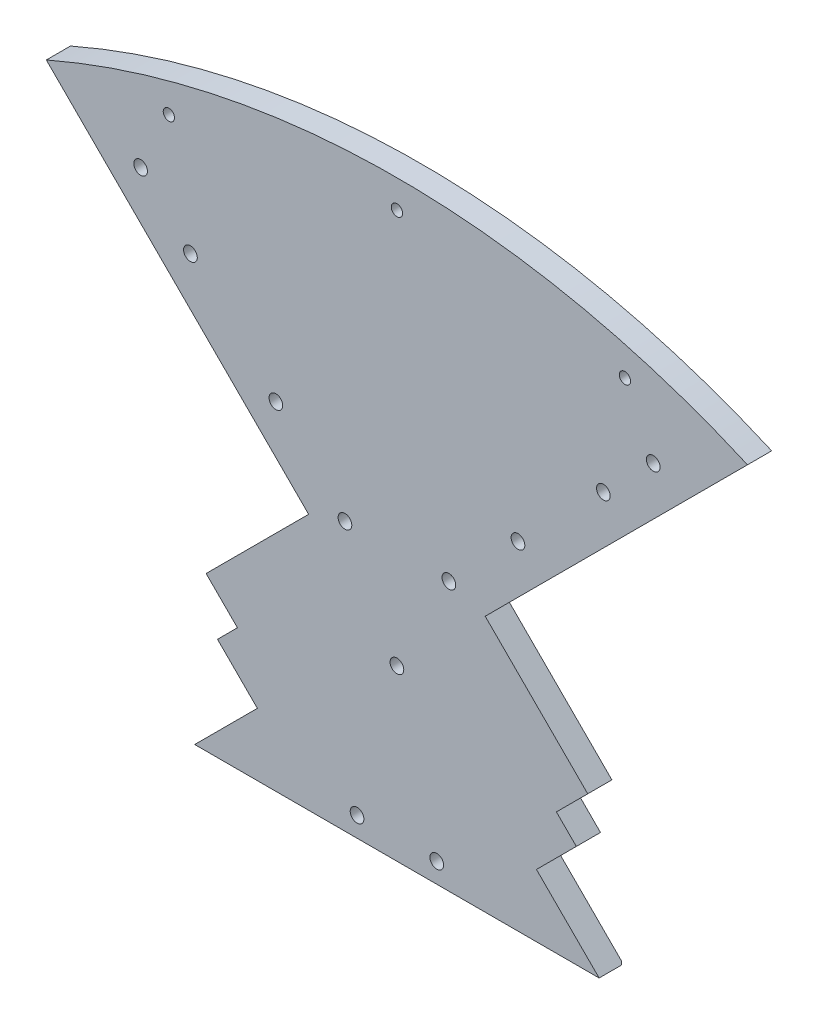
ISO-10303-21;
HEADER;
FILE_DESCRIPTION(('STEP AP214'),'2;1');
FILE_NAME('part.step','',(''),(''),'','','');
FILE_SCHEMA(('AUTOMOTIVE_DESIGN { 1 0 10303 214 1 1 1 1 }'));
ENDSEC;
DATA;
#1=APPLICATION_CONTEXT('core data for automotive mechanical design processes');
#2=APPLICATION_PROTOCOL_DEFINITION('international standard','automotive_design',2000,#1);
#3=PRODUCT_CONTEXT('',#1,'mechanical');
#4=PRODUCT('Part','Part','',(#3));
#5=PRODUCT_RELATED_PRODUCT_CATEGORY('part','',(#4));
#6=PRODUCT_DEFINITION_FORMATION('','',#4);
#7=PRODUCT_DEFINITION_CONTEXT('part definition',#1,'design');
#8=PRODUCT_DEFINITION('design','',#6,#7);
#9=PRODUCT_DEFINITION_SHAPE('','',#8);
#10=(LENGTH_UNIT() NAMED_UNIT(*) SI_UNIT(.MILLI.,.METRE.));
#11=(NAMED_UNIT(*) PLANE_ANGLE_UNIT() SI_UNIT($,.RADIAN.));
#12=(NAMED_UNIT(*) SI_UNIT($,.STERADIAN.) SOLID_ANGLE_UNIT());
#13=UNCERTAINTY_MEASURE_WITH_UNIT(LENGTH_MEASURE(1.E-05),#10,'distance_accuracy_value','');
#14=(GEOMETRIC_REPRESENTATION_CONTEXT(3) GLOBAL_UNCERTAINTY_ASSIGNED_CONTEXT((#13)) GLOBAL_UNIT_ASSIGNED_CONTEXT((#10,
#11,#12)) REPRESENTATION_CONTEXT('',''));
#15=CARTESIAN_POINT('',(0.,0.,0.));
#16=DIRECTION('',(0.,0.,1.));
#17=DIRECTION('',(1.,0.,0.));
#18=AXIS2_PLACEMENT_3D('',#15,#16,#17);
#19=CARTESIAN_POINT('',(0.,0.,67.));
#20=DIRECTION('',(0.,0.,1.));
#21=DIRECTION('',(1.,0.,0.));
#22=AXIS2_PLACEMENT_3D('',#19,#20,#21);
#23=PLANE('',#22);
#24=CARTESIAN_POINT('',(56.620161762074,202.22303845515,67.));
#25=DIRECTION('',(0.,0.,1.));
#26=DIRECTION('',(1.,0.,0.));
#27=AXIS2_PLACEMENT_3D('',#24,#25,#26);
#28=CIRCLE('',#27,1.4);
#29=CARTESIAN_POINT('',(58.020161762074,202.22303845515,67.));
#30=VERTEX_POINT('',#29);
#31=EDGE_CURVE('E24',#30,#30,#28,.T.);
#32=ORIENTED_EDGE('',*,*,#31,.T.);
#33=EDGE_LOOP('',(#32));
#34=FACE_BOUND('',#33,.T.);
#35=CARTESIAN_POINT('',(63.639610306789,187.38329701443,67.));
#36=DIRECTION('',(0.,0.,1.));
#37=DIRECTION('',(1.,0.,0.));
#38=AXIS2_PLACEMENT_3D('',#35,#36,#37);
#39=CIRCLE('',#38,1.7);
#40=CARTESIAN_POINT('',(65.339610306789,187.38329701443,67.));
#41=VERTEX_POINT('',#40);
#42=EDGE_CURVE('E373',#41,#41,#39,.T.);
#43=ORIENTED_EDGE('',*,*,#42,.T.);
#44=EDGE_LOOP('',(#43));
#45=FACE_BOUND('',#44,.T.);
#46=CARTESIAN_POINT('',(0.,210.,67.));
#47=DIRECTION('',(0.,0.,1.));
#48=DIRECTION('',(1.,0.,0.));
#49=AXIS2_PLACEMENT_3D('',#46,#47,#48);
#50=CIRCLE('',#49,1.4);
#51=CARTESIAN_POINT('',(1.4,210.,67.));
#52=VERTEX_POINT('',#51);
#53=EDGE_CURVE('E387',#52,#52,#50,.T.);
#54=ORIENTED_EDGE('',*,*,#53,.T.);
#55=EDGE_LOOP('',(#54));
#56=FACE_BOUND('',#55,.T.);
#57=CARTESIAN_POINT('',(51.265241636025,175.00892834367,67.));
#58=DIRECTION('',(0.,0.,1.));
#59=DIRECTION('',(1.,0.,0.));
#60=AXIS2_PLACEMENT_3D('',#57,#58,#59);
#61=CIRCLE('',#60,1.7);
#62=CARTESIAN_POINT('',(52.965241636025,175.00892834367,67.));
#63=VERTEX_POINT('',#62);
#64=EDGE_CURVE('E368',#63,#63,#61,.T.);
#65=ORIENTED_EDGE('',*,*,#64,.T.);
#66=EDGE_LOOP('',(#65));
#67=FACE_BOUND('',#66,.T.);
#68=CARTESIAN_POINT('',(30.052038200428,153.79572490807,67.));
#69=DIRECTION('',(0.,0.,1.));
#70=DIRECTION('',(1.,0.,0.));
#71=AXIS2_PLACEMENT_3D('',#68,#69,#70);
#72=CIRCLE('',#71,1.7);
#73=CARTESIAN_POINT('',(31.752038200428,153.79572490807,67.));
#74=VERTEX_POINT('',#73);
#75=EDGE_CURVE('E369',#74,#74,#72,.T.);
#76=ORIENTED_EDGE('',*,*,#75,.T.);
#77=EDGE_LOOP('',(#76));
#78=FACE_BOUND('',#77,.T.);
#79=CARTESIAN_POINT('',(-56.62016176207,202.22303845515,67.));
#80=DIRECTION('',(0.,0.,1.));
#81=DIRECTION('',(1.,0.,0.));
#82=AXIS2_PLACEMENT_3D('',#79,#80,#81);
#83=CIRCLE('',#82,1.4);
#84=CARTESIAN_POINT('',(-55.22016176207,202.22303845515,67.));
#85=VERTEX_POINT('',#84);
#86=EDGE_CURVE('E479',#85,#85,#83,.T.);
#87=ORIENTED_EDGE('',*,*,#86,.T.);
#88=EDGE_LOOP('',(#87));
#89=FACE_BOUND('',#88,.T.);
#90=CARTESIAN_POINT('',(-63.63961030678,187.38329701443,67.));
#91=DIRECTION('',(0.,0.,1.));
#92=DIRECTION('',(1.,0.,0.));
#93=AXIS2_PLACEMENT_3D('',#90,#91,#92);
#94=CIRCLE('',#93,1.7);
#95=CARTESIAN_POINT('',(-61.93961030678,187.38329701443,67.));
#96=VERTEX_POINT('',#95);
#97=EDGE_CURVE('E361',#96,#96,#94,.T.);
#98=ORIENTED_EDGE('',*,*,#97,.T.);
#99=EDGE_LOOP('',(#98));
#100=FACE_BOUND('',#99,.T.);
#101=CARTESIAN_POINT('',(-30.05203820042,153.79572490807,67.));
#102=DIRECTION('',(0.,0.,1.));
#103=DIRECTION('',(1.,0.,0.));
#104=AXIS2_PLACEMENT_3D('',#101,#102,#103);
#105=CIRCLE('',#104,1.7);
#106=CARTESIAN_POINT('',(-28.35203820042,153.79572490807,67.));
#107=VERTEX_POINT('',#106);
#108=EDGE_CURVE('E356',#107,#107,#105,.T.);
#109=ORIENTED_EDGE('',*,*,#108,.T.);
#110=EDGE_LOOP('',(#109));
#111=FACE_BOUND('',#110,.T.);
#112=CARTESIAN_POINT('',(-51.26524163602,175.00892834367,67.));
#113=DIRECTION('',(0.,0.,1.));
#114=DIRECTION('',(1.,0.,0.));
#115=AXIS2_PLACEMENT_3D('',#112,#113,#114);
#116=CIRCLE('',#115,1.7);
#117=CARTESIAN_POINT('',(-49.56524163602,175.00892834367,67.));
#118=VERTEX_POINT('',#117);
#119=EDGE_CURVE('E455',#118,#118,#116,.T.);
#120=ORIENTED_EDGE('',*,*,#119,.T.);
#121=EDGE_LOOP('',(#120));
#122=FACE_BOUND('',#121,.T.);
#123=CARTESIAN_POINT('',(12.904698756655,136.6483854643,67.));
#124=DIRECTION('',(0.,0.,1.));
#125=DIRECTION('',(1.,0.,0.));
#126=AXIS2_PLACEMENT_3D('',#123,#124,#125);
#127=CIRCLE('',#126,1.7);
#128=CARTESIAN_POINT('',(14.604698756655,136.6483854643,67.));
#129=VERTEX_POINT('',#128);
#130=EDGE_CURVE('E397',#129,#129,#127,.T.);
#131=ORIENTED_EDGE('',*,*,#130,.T.);
#132=EDGE_LOOP('',(#131));
#133=FACE_BOUND('',#132,.T.);
#134=CARTESIAN_POINT('',(9.899494936612,74.953318805774,67.));
#135=DIRECTION('',(0.,0.,1.));
#136=DIRECTION('',(1.,0.,0.));
#137=AXIS2_PLACEMENT_3D('',#134,#135,#136);
#138=CIRCLE('',#137,1.7);
#139=CARTESIAN_POINT('',(11.599494936612,74.953318805774,67.));
#140=VERTEX_POINT('',#139);
#141=EDGE_CURVE('E374',#140,#140,#138,.T.);
#142=ORIENTED_EDGE('',*,*,#141,.T.);
#143=EDGE_LOOP('',(#142));
#144=FACE_BOUND('',#143,.T.);
#145=CARTESIAN_POINT('',(-12.90469875665,136.6483854643,67.));
#146=DIRECTION('',(0.,0.,1.));
#147=DIRECTION('',(1.,0.,0.));
#148=AXIS2_PLACEMENT_3D('',#145,#146,#147);
#149=CIRCLE('',#148,1.7);
#150=CARTESIAN_POINT('',(-11.20469875665,136.6483854643,67.));
#151=VERTEX_POINT('',#150);
#152=EDGE_CURVE('E390',#151,#151,#149,.T.);
#153=ORIENTED_EDGE('',*,*,#152,.T.);
#154=EDGE_LOOP('',(#153));
#155=FACE_BOUND('',#154,.T.);
#156=CARTESIAN_POINT('',(0.,112.,67.));
#157=DIRECTION('',(0.,0.,1.));
#158=DIRECTION('',(1.,0.,0.));
#159=AXIS2_PLACEMENT_3D('',#156,#157,#158);
#160=CIRCLE('',#159,1.7);
#161=CARTESIAN_POINT('',(1.7,112.,67.));
#162=VERTEX_POINT('',#161);
#163=EDGE_CURVE('E351',#162,#162,#160,.T.);
#164=ORIENTED_EDGE('',*,*,#163,.T.);
#165=EDGE_LOOP('',(#164));
#166=FACE_BOUND('',#165,.T.);
#167=CARTESIAN_POINT('',(-9.899494936612,74.953318805774,67.));
#168=DIRECTION('',(0.,0.,1.));
#169=DIRECTION('',(1.,0.,0.));
#170=AXIS2_PLACEMENT_3D('',#167,#168,#169);
#171=CIRCLE('',#170,1.7);
#172=CARTESIAN_POINT('',(-8.199494936612,74.953318805774,67.));
#173=VERTEX_POINT('',#172);
#174=EDGE_CURVE('E436',#173,#173,#171,.T.);
#175=ORIENTED_EDGE('',*,*,#174,.T.);
#176=EDGE_LOOP('',(#175));
#177=FACE_BOUND('',#176,.T.);
#178=DIRECTION('',(-0.707106781186548,-0.707106781186548,0.));
#179=VECTOR('',#178,1.);
#180=CARTESIAN_POINT('',(-54.80077554195,85.206367132979,67.));
#181=LINE('',#180,#179);
#182=CARTESIAN_POINT('',(-39.59797974644,100.40916292849,67.));
#183=VERTEX_POINT('',#182);
#184=CARTESIAN_POINT('',(-44.54772721475,95.459415460184,67.));
#185=VERTEX_POINT('',#184);
#186=EDGE_CURVE('E312',#183,#185,#181,.T.);
#187=ORIENTED_EDGE('',*,*,#186,.F.);
#188=DIRECTION('',(0.707106781186548,-0.707106781186548,0.));
#189=VECTOR('',#188,1.);
#190=CARTESIAN_POINT('',(-4.596194077713,65.407377259756,67.));
#191=LINE('',#190,#189);
#192=CARTESIAN_POINT('',(-47.37615433949,108.18733752154,67.));
#193=VERTEX_POINT('',#192);
#194=EDGE_CURVE('E246',#193,#183,#191,.T.);
#195=ORIENTED_EDGE('',*,*,#194,.F.);
#196=DIRECTION('',(-0.707106781186548,-0.707106781186548,0.));
#197=VECTOR('',#196,1.);
#198=CARTESIAN_POINT('',(-49.85102807365,105.71246378738,67.));
#199=LINE('',#198,#197);
#200=CARTESIAN_POINT('',(-21.92031021678,133.64318164425,67.));
#201=VERTEX_POINT('',#200);
#202=EDGE_CURVE('E244',#201,#193,#199,.T.);
#203=ORIENTED_EDGE('',*,*,#202,.F.);
#204=DIRECTION('',(0.707106781186548,-0.707106781186548,0.));
#205=VECTOR('',#204,1.);
#206=CARTESIAN_POINT('',(16.970562748477,94.752308678997,67.));
#207=LINE('',#206,#205);
#208=CARTESIAN_POINT('',(-87.05112496586,198.77399639333,67.));
#209=VERTEX_POINT('',#208);
#210=EDGE_CURVE('E231',#209,#201,#207,.T.);
#211=ORIENTED_EDGE('',*,*,#210,.F.);
#212=CARTESIAN_POINT('',(0.,0.,67.));
#213=DIRECTION('',(0.,0.,-1.));
#214=DIRECTION('',(-0.959406277217956,0.282027649769987,0.));
#215=AXIS2_PLACEMENT_3D('',#212,#213,#214);
#216=CIRCLE('',#215,217.);
#217=CARTESIAN_POINT('',(87.051124965862,198.77399639333,67.));
#218=VERTEX_POINT('',#217);
#219=EDGE_CURVE('E346',#209,#218,#216,.T.);
#220=ORIENTED_EDGE('',*,*,#219,.T.);
#221=DIRECTION('',(-0.707106781186548,-0.707106781186548,0.));
#222=VECTOR('',#221,1.);
#223=CARTESIAN_POINT('',(-16.97056274847,94.752308678997,67.));
#224=LINE('',#223,#222);
#225=CARTESIAN_POINT('',(21.920310216783,133.64318164425,67.));
#226=VERTEX_POINT('',#225);
#227=EDGE_CURVE('E279',#218,#226,#224,.T.);
#228=ORIENTED_EDGE('',*,*,#227,.T.);
#229=DIRECTION('',(-0.707106781186548,0.707106781186548,0.));
#230=VECTOR('',#229,1.);
#231=CARTESIAN_POINT('',(105.71246378738,49.851028073652,67.));
#232=LINE('',#231,#230);
#233=CARTESIAN_POINT('',(47.376154339499,108.18733752154,67.));
#234=VERTEX_POINT('',#233);
#235=EDGE_CURVE('E349',#234,#226,#232,.T.);
#236=ORIENTED_EDGE('',*,*,#235,.F.);
#237=DIRECTION('',(-0.707106781186548,-0.707106781186548,0.));
#238=VECTOR('',#237,1.);
#239=CARTESIAN_POINT('',(4.596194077713,65.407377259756,67.));
#240=LINE('',#239,#238);
#241=CARTESIAN_POINT('',(39.597979746447,100.40916292849,67.));
#242=VERTEX_POINT('',#241);
#243=EDGE_CURVE('E329',#234,#242,#240,.T.);
#244=ORIENTED_EDGE('',*,*,#243,.T.);
#245=DIRECTION('',(-0.707106781186548,0.707106781186548,0.));
#246=VECTOR('',#245,1.);
#247=CARTESIAN_POINT('',(85.206367132979,54.800775541957,67.));
#248=LINE('',#247,#246);
#249=CARTESIAN_POINT('',(44.547727214752,95.459415460184,67.));
#250=VERTEX_POINT('',#249);
#251=EDGE_CURVE('E250',#250,#242,#248,.T.);
#252=ORIENTED_EDGE('',*,*,#251,.F.);
#253=DIRECTION('',(-0.707106781186548,-0.707106781186548,0.));
#254=VECTOR('',#253,1.);
#255=CARTESIAN_POINT('',(4.596194077713,55.507882323144,67.));
#256=LINE('',#255,#254);
#257=CARTESIAN_POINT('',(34.648232278141,85.559920523572,67.));
#258=VERTEX_POINT('',#257);
#259=EDGE_CURVE('E263',#250,#258,#256,.T.);
#260=ORIENTED_EDGE('',*,*,#259,.T.);
#261=DIRECTION('',(-0.707106781186548,0.707106781186548,0.));
#262=VECTOR('',#261,1.);
#263=CARTESIAN_POINT('',(72.831998462214,47.376154339499,67.));
#264=LINE('',#263,#262);
#265=CARTESIAN_POINT('',(49.708152801713,70.5,67.));
#266=VERTEX_POINT('',#265);
#267=EDGE_CURVE('E319',#266,#258,#264,.T.);
#268=ORIENTED_EDGE('',*,*,#267,.F.);
#269=DIRECTION('',(1.,0.,0.));
#270=VECTOR('',#269,1.);
#271=CARTESIAN_POINT('',(-71.,70.5,67.));
#272=LINE('',#271,#270);
#273=CARTESIAN_POINT('',(-49.70815280171,70.5,67.));
#274=VERTEX_POINT('',#273);
#275=EDGE_CURVE('E9',#274,#266,#272,.T.);
#276=ORIENTED_EDGE('',*,*,#275,.F.);
#277=DIRECTION('',(-0.707106781186548,-0.707106781186548,0.));
#278=VECTOR('',#277,1.);
#279=CARTESIAN_POINT('',(-47.37615433949,72.831998462214,67.));
#280=LINE('',#279,#278);
#281=CARTESIAN_POINT('',(-34.64823227814,85.559920523572,67.));
#282=VERTEX_POINT('',#281);
#283=EDGE_CURVE('E296',#282,#274,#280,.T.);
#284=ORIENTED_EDGE('',*,*,#283,.F.);
#285=DIRECTION('',(0.707106781186548,-0.707106781186548,0.));
#286=VECTOR('',#285,1.);
#287=CARTESIAN_POINT('',(-4.596194077713,55.507882323144,67.));
#288=LINE('',#287,#286);
#289=EDGE_CURVE('E463',#185,#282,#288,.T.);
#290=ORIENTED_EDGE('',*,*,#289,.F.);
#291=EDGE_LOOP('',(#187,#195,#203,#211,#220,#228,#236,#244,#252,#260,#268,#276,#284,#290));
#292=FACE_BOUND('',#291,.T.);
#293=ADVANCED_FACE('F14',(#34,#45,#56,#67,#78,#89,#100,#111,#122,#133,#144,#155,#166,#177,#292),
#23,.F.);
#294=CARTESIAN_POINT('',(-71.,70.5,67.));
#295=DIRECTION('',(0.,0.707106781186548,0.707106781186548));
#296=DIRECTION('',(1.,0.,0.));
#297=AXIS2_PLACEMENT_3D('',#294,#295,#296);
#298=PLANE('',#297);
#299=DIRECTION('',(0.577350269189626,-0.577350269189626,0.577350269189626));
#300=VECTOR('',#299,1.);
#301=CARTESIAN_POINT('',(38.207383242047,82.000769559666,55.499230440334));
#302=LINE('',#301,#300);
#303=CARTESIAN_POINT('',(50.208152801713,70.,67.5));
#304=VERTEX_POINT('',#303);
#305=EDGE_CURVE('E315',#266,#304,#302,.T.);
#306=ORIENTED_EDGE('',*,*,#305,.T.);
#307=DIRECTION('',(1.,0.,0.));
#308=VECTOR('',#307,1.);
#309=CARTESIAN_POINT('',(-71.,70.,67.5));
#310=LINE('',#309,#308);
#311=CARTESIAN_POINT('',(-50.20815280171,70.,67.5));
#312=VERTEX_POINT('',#311);
#313=EDGE_CURVE('E394',#312,#304,#310,.T.);
#314=ORIENTED_EDGE('',*,*,#313,.F.);
#315=DIRECTION('',(0.577350269189626,0.577350269189626,-0.577350269189626));
#316=VECTOR('',#315,1.);
#317=CARTESIAN_POINT('',(-44.90348716023,75.304665641476,62.195334358524));
#318=LINE('',#317,#316);
#319=EDGE_CURVE('E300',#312,#274,#318,.T.);
#320=ORIENTED_EDGE('',*,*,#319,.T.);
#321=ORIENTED_EDGE('',*,*,#275,.T.);
#322=EDGE_LOOP('',(#306,#314,#320,#321));
#323=FACE_BOUND('',#322,.T.);
#324=ADVANCED_FACE('F505',(#323),#298,.F.);
#325=CARTESIAN_POINT('',(56.620161762074,202.22303845515,66.89));
#326=DIRECTION('',(0.,0.,1.));
#327=DIRECTION('',(1.,0.,0.));
#328=AXIS2_PLACEMENT_3D('',#325,#326,#327);
#329=CYLINDRICAL_SURFACE('',#328,1.4);
#330=DIRECTION('',(0.,0.,1.));
#331=VECTOR('',#330,1.);
#332=CARTESIAN_POINT('',(58.020161762074,202.22303845515,66.89));
#333=LINE('',#332,#331);
#334=CARTESIAN_POINT('',(58.020161762074,202.22303845515,73.));
#335=VERTEX_POINT('',#334);
#336=EDGE_CURVE('E370',#30,#335,#333,.T.);
#337=ORIENTED_EDGE('',*,*,#336,.F.);
#338=ORIENTED_EDGE('',*,*,#31,.F.);
#339=ORIENTED_EDGE('',*,*,#336,.T.);
#340=CARTESIAN_POINT('',(56.620161762074,202.22303845515,73.));
#341=DIRECTION('',(0.,0.,1.));
#342=DIRECTION('',(1.,0.,0.));
#343=AXIS2_PLACEMENT_3D('',#340,#341,#342);
#344=CIRCLE('',#343,1.4);
#345=EDGE_CURVE('E311',#335,#335,#344,.T.);
#346=ORIENTED_EDGE('',*,*,#345,.T.);
#347=EDGE_LOOP('',(#337,#338,#339,#346));
#348=FACE_BOUND('',#347,.T.);
#349=ADVANCED_FACE('F889',(#348),#329,.F.);
#350=CARTESIAN_POINT('',(63.639610306789,187.38329701443,47.));
#351=DIRECTION('',(0.,0.,1.));
#352=DIRECTION('',(1.,0.,0.));
#353=AXIS2_PLACEMENT_3D('',#350,#351,#352);
#354=CYLINDRICAL_SURFACE('',#353,1.7);
#355=DIRECTION('',(0.,0.,1.));
#356=VECTOR('',#355,1.);
#357=CARTESIAN_POINT('',(65.339610306789,187.38329701443,47.));
#358=LINE('',#357,#356);
#359=CARTESIAN_POINT('',(65.339610306789,187.38329701443,73.));
#360=VERTEX_POINT('',#359);
#361=EDGE_CURVE('E414',#41,#360,#358,.T.);
#362=ORIENTED_EDGE('',*,*,#361,.F.);
#363=ORIENTED_EDGE('',*,*,#42,.F.);
#364=ORIENTED_EDGE('',*,*,#361,.T.);
#365=CARTESIAN_POINT('',(63.639610306789,187.38329701443,73.));
#366=DIRECTION('',(0.,0.,1.));
#367=DIRECTION('',(1.,0.,0.));
#368=AXIS2_PLACEMENT_3D('',#365,#366,#367);
#369=CIRCLE('',#368,1.7);
#370=EDGE_CURVE('E339',#360,#360,#369,.T.);
#371=ORIENTED_EDGE('',*,*,#370,.T.);
#372=EDGE_LOOP('',(#362,#363,#364,#371));
#373=FACE_BOUND('',#372,.T.);
#374=ADVANCED_FACE('F948',(#373),#354,.F.);
#375=CARTESIAN_POINT('',(0.,210.,66.89));
#376=DIRECTION('',(0.,0.,1.));
#377=DIRECTION('',(1.,0.,0.));
#378=AXIS2_PLACEMENT_3D('',#375,#376,#377);
#379=CYLINDRICAL_SURFACE('',#378,1.4);
#380=DIRECTION('',(0.,0.,1.));
#381=VECTOR('',#380,1.);
#382=CARTESIAN_POINT('',(1.4,210.,66.89));
#383=LINE('',#382,#381);
#384=CARTESIAN_POINT('',(1.4,210.,73.));
#385=VERTEX_POINT('',#384);
#386=EDGE_CURVE('E383',#52,#385,#383,.T.);
#387=ORIENTED_EDGE('',*,*,#386,.F.);
#388=ORIENTED_EDGE('',*,*,#53,.F.);
#389=ORIENTED_EDGE('',*,*,#386,.T.);
#390=CARTESIAN_POINT('',(0.,210.,73.));
#391=DIRECTION('',(0.,0.,1.));
#392=DIRECTION('',(1.,0.,0.));
#393=AXIS2_PLACEMENT_3D('',#390,#391,#392);
#394=CIRCLE('',#393,1.4);
#395=EDGE_CURVE('E294',#385,#385,#394,.T.);
#396=ORIENTED_EDGE('',*,*,#395,.T.);
#397=EDGE_LOOP('',(#387,#388,#389,#396));
#398=FACE_BOUND('',#397,.T.);
#399=ADVANCED_FACE('F946',(#398),#379,.F.);
#400=CARTESIAN_POINT('',(51.265241636025,175.00892834367,47.));
#401=DIRECTION('',(0.,0.,1.));
#402=DIRECTION('',(1.,0.,0.));
#403=AXIS2_PLACEMENT_3D('',#400,#401,#402);
#404=CYLINDRICAL_SURFACE('',#403,1.7);
#405=DIRECTION('',(0.,0.,1.));
#406=VECTOR('',#405,1.);
#407=CARTESIAN_POINT('',(52.965241636025,175.00892834367,47.));
#408=LINE('',#407,#406);
#409=CARTESIAN_POINT('',(52.965241636025,175.00892834367,73.));
#410=VERTEX_POINT('',#409);
#411=EDGE_CURVE('E365',#63,#410,#408,.T.);
#412=ORIENTED_EDGE('',*,*,#411,.F.);
#413=ORIENTED_EDGE('',*,*,#64,.F.);
#414=ORIENTED_EDGE('',*,*,#411,.T.);
#415=CARTESIAN_POINT('',(51.265241636025,175.00892834367,73.));
#416=DIRECTION('',(0.,0.,1.));
#417=DIRECTION('',(1.,0.,0.));
#418=AXIS2_PLACEMENT_3D('',#415,#416,#417);
#419=CIRCLE('',#418,1.7);
#420=EDGE_CURVE('E290',#410,#410,#419,.T.);
#421=ORIENTED_EDGE('',*,*,#420,.T.);
#422=EDGE_LOOP('',(#412,#413,#414,#421));
#423=FACE_BOUND('',#422,.T.);
#424=ADVANCED_FACE('F944',(#423),#404,.F.);
#425=CARTESIAN_POINT('',(30.052038200428,153.79572490807,47.));
#426=DIRECTION('',(0.,0.,1.));
#427=DIRECTION('',(1.,0.,0.));
#428=AXIS2_PLACEMENT_3D('',#425,#426,#427);
#429=CYLINDRICAL_SURFACE('',#428,1.7);
#430=DIRECTION('',(0.,0.,1.));
#431=VECTOR('',#430,1.);
#432=CARTESIAN_POINT('',(31.752038200428,153.79572490807,47.));
#433=LINE('',#432,#431);
#434=CARTESIAN_POINT('',(31.752038200428,153.79572490807,73.));
#435=VERTEX_POINT('',#434);
#436=EDGE_CURVE('E770',#74,#435,#433,.T.);
#437=ORIENTED_EDGE('',*,*,#436,.F.);
#438=ORIENTED_EDGE('',*,*,#75,.F.);
#439=ORIENTED_EDGE('',*,*,#436,.T.);
#440=CARTESIAN_POINT('',(30.052038200428,153.79572490807,73.));
#441=DIRECTION('',(0.,0.,1.));
#442=DIRECTION('',(1.,0.,0.));
#443=AXIS2_PLACEMENT_3D('',#440,#441,#442);
#444=CIRCLE('',#443,1.7);
#445=EDGE_CURVE('E295',#435,#435,#444,.T.);
#446=ORIENTED_EDGE('',*,*,#445,.T.);
#447=EDGE_LOOP('',(#437,#438,#439,#446));
#448=FACE_BOUND('',#447,.T.);
#449=ADVANCED_FACE('F821',(#448),#429,.F.);
#450=CARTESIAN_POINT('',(-56.62016176207,202.22303845515,66.89));
#451=DIRECTION('',(0.,0.,1.));
#452=DIRECTION('',(1.,0.,0.));
#453=AXIS2_PLACEMENT_3D('',#450,#451,#452);
#454=CYLINDRICAL_SURFACE('',#453,1.4);
#455=DIRECTION('',(0.,0.,1.));
#456=VECTOR('',#455,1.);
#457=CARTESIAN_POINT('',(-55.22016176207,202.22303845515,66.89));
#458=LINE('',#457,#456);
#459=CARTESIAN_POINT('',(-55.22016176207,202.22303845515,73.));
#460=VERTEX_POINT('',#459);
#461=EDGE_CURVE('E364',#85,#460,#458,.T.);
#462=ORIENTED_EDGE('',*,*,#461,.F.);
#463=ORIENTED_EDGE('',*,*,#86,.F.);
#464=ORIENTED_EDGE('',*,*,#461,.T.);
#465=CARTESIAN_POINT('',(-56.62016176207,202.22303845515,73.));
#466=DIRECTION('',(0.,0.,1.));
#467=DIRECTION('',(1.,0.,0.));
#468=AXIS2_PLACEMENT_3D('',#465,#466,#467);
#469=CIRCLE('',#468,1.4);
#470=EDGE_CURVE('E473',#460,#460,#469,.T.);
#471=ORIENTED_EDGE('',*,*,#470,.T.);
#472=EDGE_LOOP('',(#462,#463,#464,#471));
#473=FACE_BOUND('',#472,.T.);
#474=ADVANCED_FACE('F991',(#473),#454,.F.);
#475=CARTESIAN_POINT('',(-63.63961030678,187.38329701443,47.));
#476=DIRECTION('',(0.,0.,1.));
#477=DIRECTION('',(1.,0.,0.));
#478=AXIS2_PLACEMENT_3D('',#475,#476,#477);
#479=CYLINDRICAL_SURFACE('',#478,1.7);
#480=DIRECTION('',(0.,0.,1.));
#481=VECTOR('',#480,1.);
#482=CARTESIAN_POINT('',(-61.93961030678,187.38329701443,47.));
#483=LINE('',#482,#481);
#484=CARTESIAN_POINT('',(-61.93961030678,187.38329701443,73.));
#485=VERTEX_POINT('',#484);
#486=EDGE_CURVE('E359',#96,#485,#483,.T.);
#487=ORIENTED_EDGE('',*,*,#486,.F.);
#488=ORIENTED_EDGE('',*,*,#97,.F.);
#489=ORIENTED_EDGE('',*,*,#486,.T.);
#490=CARTESIAN_POINT('',(-63.63961030678,187.38329701443,73.));
#491=DIRECTION('',(0.,0.,1.));
#492=DIRECTION('',(1.,0.,0.));
#493=AXIS2_PLACEMENT_3D('',#490,#491,#492);
#494=CIRCLE('',#493,1.7);
#495=EDGE_CURVE('E418',#485,#485,#494,.T.);
#496=ORIENTED_EDGE('',*,*,#495,.T.);
#497=EDGE_LOOP('',(#487,#488,#489,#496));
#498=FACE_BOUND('',#497,.T.);
#499=ADVANCED_FACE('F928',(#498),#479,.F.);
#500=CARTESIAN_POINT('',(-30.05203820042,153.79572490807,47.));
#501=DIRECTION('',(0.,0.,1.));
#502=DIRECTION('',(1.,0.,0.));
#503=AXIS2_PLACEMENT_3D('',#500,#501,#502);
#504=CYLINDRICAL_SURFACE('',#503,1.7);
#505=DIRECTION('',(0.,0.,1.));
#506=VECTOR('',#505,1.);
#507=CARTESIAN_POINT('',(-28.35203820042,153.79572490807,47.));
#508=LINE('',#507,#506);
#509=CARTESIAN_POINT('',(-28.35203820042,153.79572490807,73.));
#510=VERTEX_POINT('',#509);
#511=EDGE_CURVE('E360',#107,#510,#508,.T.);
#512=ORIENTED_EDGE('',*,*,#511,.F.);
#513=ORIENTED_EDGE('',*,*,#108,.F.);
#514=ORIENTED_EDGE('',*,*,#511,.T.);
#515=CARTESIAN_POINT('',(-30.05203820042,153.79572490807,73.));
#516=DIRECTION('',(0.,0.,1.));
#517=DIRECTION('',(1.,0.,0.));
#518=AXIS2_PLACEMENT_3D('',#515,#516,#517);
#519=CIRCLE('',#518,1.7);
#520=EDGE_CURVE('E415',#510,#510,#519,.T.);
#521=ORIENTED_EDGE('',*,*,#520,.T.);
#522=EDGE_LOOP('',(#512,#513,#514,#521));
#523=FACE_BOUND('',#522,.T.);
#524=ADVANCED_FACE('F1034',(#523),#504,.F.);
#525=CARTESIAN_POINT('',(-51.26524163602,175.00892834367,47.));
#526=DIRECTION('',(0.,0.,1.));
#527=DIRECTION('',(1.,0.,0.));
#528=AXIS2_PLACEMENT_3D('',#525,#526,#527);
#529=CYLINDRICAL_SURFACE('',#528,1.7);
#530=DIRECTION('',(0.,0.,1.));
#531=VECTOR('',#530,1.);
#532=CARTESIAN_POINT('',(-49.56524163602,175.00892834367,47.));
#533=LINE('',#532,#531);
#534=CARTESIAN_POINT('',(-49.56524163602,175.00892834367,73.));
#535=VERTEX_POINT('',#534);
#536=EDGE_CURVE('E458',#118,#535,#533,.T.);
#537=ORIENTED_EDGE('',*,*,#536,.F.);
#538=ORIENTED_EDGE('',*,*,#119,.F.);
#539=ORIENTED_EDGE('',*,*,#536,.T.);
#540=CARTESIAN_POINT('',(-51.26524163602,175.00892834367,73.));
#541=DIRECTION('',(0.,0.,1.));
#542=DIRECTION('',(1.,0.,0.));
#543=AXIS2_PLACEMENT_3D('',#540,#541,#542);
#544=CIRCLE('',#543,1.7);
#545=EDGE_CURVE('E419',#535,#535,#544,.T.);
#546=ORIENTED_EDGE('',*,*,#545,.T.);
#547=EDGE_LOOP('',(#537,#538,#539,#546));
#548=FACE_BOUND('',#547,.T.);
#549=ADVANCED_FACE('F942',(#548),#529,.F.);
#550=CARTESIAN_POINT('',(12.904698756655,136.6483854643,47.));
#551=DIRECTION('',(0.,0.,1.));
#552=DIRECTION('',(1.,0.,0.));
#553=AXIS2_PLACEMENT_3D('',#550,#551,#552);
#554=CYLINDRICAL_SURFACE('',#553,1.7);
#555=DIRECTION('',(0.,0.,1.));
#556=VECTOR('',#555,1.);
#557=CARTESIAN_POINT('',(14.604698756655,136.6483854643,47.));
#558=LINE('',#557,#556);
#559=CARTESIAN_POINT('',(14.604698756655,136.6483854643,73.));
#560=VERTEX_POINT('',#559);
#561=EDGE_CURVE('E377',#129,#560,#558,.T.);
#562=ORIENTED_EDGE('',*,*,#561,.F.);
#563=ORIENTED_EDGE('',*,*,#130,.F.);
#564=ORIENTED_EDGE('',*,*,#561,.T.);
#565=CARTESIAN_POINT('',(12.904698756655,136.6483854643,73.));
#566=DIRECTION('',(0.,0.,1.));
#567=DIRECTION('',(1.,0.,0.));
#568=AXIS2_PLACEMENT_3D('',#565,#566,#567);
#569=CIRCLE('',#568,1.7);
#570=EDGE_CURVE('E288',#560,#560,#569,.T.);
#571=ORIENTED_EDGE('',*,*,#570,.T.);
#572=EDGE_LOOP('',(#562,#563,#564,#571));
#573=FACE_BOUND('',#572,.T.);
#574=ADVANCED_FACE('F938',(#573),#554,.F.);
#575=CARTESIAN_POINT('',(9.899494936612,74.953318805774,47.));
#576=DIRECTION('',(0.,0.,1.));
#577=DIRECTION('',(1.,0.,0.));
#578=AXIS2_PLACEMENT_3D('',#575,#576,#577);
#579=CYLINDRICAL_SURFACE('',#578,1.7);
#580=DIRECTION('',(0.,0.,1.));
#581=VECTOR('',#580,1.);
#582=CARTESIAN_POINT('',(11.599494936612,74.953318805774,47.));
#583=LINE('',#582,#581);
#584=CARTESIAN_POINT('',(11.599494936612,74.953318805774,73.));
#585=VERTEX_POINT('',#584);
#586=EDGE_CURVE('E378',#140,#585,#583,.T.);
#587=ORIENTED_EDGE('',*,*,#586,.F.);
#588=ORIENTED_EDGE('',*,*,#141,.F.);
#589=ORIENTED_EDGE('',*,*,#586,.T.);
#590=CARTESIAN_POINT('',(9.899494936612,74.953318805774,73.));
#591=DIRECTION('',(0.,0.,1.));
#592=DIRECTION('',(1.,0.,0.));
#593=AXIS2_PLACEMENT_3D('',#590,#591,#592);
#594=CIRCLE('',#593,1.7);
#595=EDGE_CURVE('E284',#585,#585,#594,.T.);
#596=ORIENTED_EDGE('',*,*,#595,.T.);
#597=EDGE_LOOP('',(#587,#588,#589,#596));
#598=FACE_BOUND('',#597,.T.);
#599=ADVANCED_FACE('F941',(#598),#579,.F.);
#600=CARTESIAN_POINT('',(-12.90469875665,136.6483854643,47.));
#601=DIRECTION('',(0.,0.,1.));
#602=DIRECTION('',(1.,0.,0.));
#603=AXIS2_PLACEMENT_3D('',#600,#601,#602);
#604=CYLINDRICAL_SURFACE('',#603,1.7);
#605=DIRECTION('',(0.,0.,1.));
#606=VECTOR('',#605,1.);
#607=CARTESIAN_POINT('',(-11.20469875665,136.6483854643,47.));
#608=LINE('',#607,#606);
#609=CARTESIAN_POINT('',(-11.20469875665,136.6483854643,73.));
#610=VERTEX_POINT('',#609);
#611=EDGE_CURVE('E354',#151,#610,#608,.T.);
#612=ORIENTED_EDGE('',*,*,#611,.F.);
#613=ORIENTED_EDGE('',*,*,#152,.F.);
#614=ORIENTED_EDGE('',*,*,#611,.T.);
#615=CARTESIAN_POINT('',(-12.90469875665,136.6483854643,73.));
#616=DIRECTION('',(0.,0.,1.));
#617=DIRECTION('',(1.,0.,0.));
#618=AXIS2_PLACEMENT_3D('',#615,#616,#617);
#619=CIRCLE('',#618,1.7);
#620=EDGE_CURVE('E289',#610,#610,#619,.T.);
#621=ORIENTED_EDGE('',*,*,#620,.T.);
#622=EDGE_LOOP('',(#612,#613,#614,#621));
#623=FACE_BOUND('',#622,.T.);
#624=ADVANCED_FACE('F934',(#623),#604,.F.);
#625=CARTESIAN_POINT('',(0.,112.,47.));
#626=DIRECTION('',(0.,0.,1.));
#627=DIRECTION('',(1.,0.,0.));
#628=AXIS2_PLACEMENT_3D('',#625,#626,#627);
#629=CYLINDRICAL_SURFACE('',#628,1.7);
#630=DIRECTION('',(0.,0.,1.));
#631=VECTOR('',#630,1.);
#632=CARTESIAN_POINT('',(1.7,112.,47.));
#633=LINE('',#632,#631);
#634=CARTESIAN_POINT('',(1.7,112.,73.));
#635=VERTEX_POINT('',#634);
#636=EDGE_CURVE('E355',#162,#635,#633,.T.);
#637=ORIENTED_EDGE('',*,*,#636,.F.);
#638=ORIENTED_EDGE('',*,*,#163,.F.);
#639=ORIENTED_EDGE('',*,*,#636,.T.);
#640=CARTESIAN_POINT('',(0.,112.,73.));
#641=DIRECTION('',(0.,0.,1.));
#642=DIRECTION('',(1.,0.,0.));
#643=AXIS2_PLACEMENT_3D('',#640,#641,#642);
#644=CIRCLE('',#643,1.7);
#645=EDGE_CURVE('E308',#635,#635,#644,.T.);
#646=ORIENTED_EDGE('',*,*,#645,.T.);
#647=EDGE_LOOP('',(#637,#638,#639,#646));
#648=FACE_BOUND('',#647,.T.);
#649=ADVANCED_FACE('F931',(#648),#629,.F.);
#650=CARTESIAN_POINT('',(-9.899494936612,74.953318805774,47.));
#651=DIRECTION('',(0.,0.,1.));
#652=DIRECTION('',(1.,0.,0.));
#653=AXIS2_PLACEMENT_3D('',#650,#651,#652);
#654=CYLINDRICAL_SURFACE('',#653,1.7);
#655=DIRECTION('',(0.,0.,1.));
#656=VECTOR('',#655,1.);
#657=CARTESIAN_POINT('',(-8.199494936612,74.953318805774,47.));
#658=LINE('',#657,#656);
#659=CARTESIAN_POINT('',(-8.199494936612,74.953318805774,73.));
#660=VERTEX_POINT('',#659);
#661=EDGE_CURVE('E282',#173,#660,#658,.T.);
#662=ORIENTED_EDGE('',*,*,#661,.F.);
#663=ORIENTED_EDGE('',*,*,#174,.F.);
#664=ORIENTED_EDGE('',*,*,#661,.T.);
#665=CARTESIAN_POINT('',(-9.899494936612,74.953318805774,73.));
#666=DIRECTION('',(0.,0.,1.));
#667=DIRECTION('',(1.,0.,0.));
#668=AXIS2_PLACEMENT_3D('',#665,#666,#667);
#669=CIRCLE('',#668,1.7);
#670=EDGE_CURVE('E441',#660,#660,#669,.T.);
#671=ORIENTED_EDGE('',*,*,#670,.T.);
#672=EDGE_LOOP('',(#662,#663,#664,#671));
#673=FACE_BOUND('',#672,.T.);
#674=ADVANCED_FACE('F914',(#673),#654,.F.);
#675=CARTESIAN_POINT('',(21.920310216783,133.64318164425,47.));
#676=DIRECTION('',(-0.707106781186548,0.707106781186548,0.));
#677=DIRECTION('',(0.,0.,1.));
#678=AXIS2_PLACEMENT_3D('',#675,#676,#677);
#679=PLANE('',#678);
#680=DIRECTION('',(0.,0.,1.));
#681=VECTOR('',#680,1.);
#682=CARTESIAN_POINT('',(87.051124965862,198.77399639333,67.));
#683=LINE('',#682,#681);
#684=CARTESIAN_POINT('',(87.051124965862,198.77399639333,73.));
#685=VERTEX_POINT('',#684);
#686=EDGE_CURVE('E350',#218,#685,#683,.T.);
#687=ORIENTED_EDGE('',*,*,#686,.T.);
#688=DIRECTION('',(-0.707106781186548,-0.707106781186548,0.));
#689=VECTOR('',#688,1.);
#690=CARTESIAN_POINT('',(-16.97056274847,94.752308678997,73.));
#691=LINE('',#690,#689);
#692=CARTESIAN_POINT('',(21.920310216783,133.64318164425,73.));
#693=VERTEX_POINT('',#692);
#694=EDGE_CURVE('E411',#685,#693,#691,.T.);
#695=ORIENTED_EDGE('',*,*,#694,.T.);
#696=DIRECTION('',(0.,0.,1.));
#697=VECTOR('',#696,1.);
#698=CARTESIAN_POINT('',(21.920310216783,133.64318164425,47.));
#699=LINE('',#698,#697);
#700=EDGE_CURVE('E283',#226,#693,#699,.T.);
#701=ORIENTED_EDGE('',*,*,#700,.F.);
#702=ORIENTED_EDGE('',*,*,#227,.F.);
#703=EDGE_LOOP('',(#687,#695,#701,#702));
#704=FACE_BOUND('',#703,.T.);
#705=ADVANCED_FACE('F870',(#704),#679,.F.);
#706=CARTESIAN_POINT('',(133.64318164425,21.920310216783,47.));
#707=DIRECTION('',(0.707106781186548,0.707106781186548,0.));
#708=DIRECTION('',(0.,0.,-1.));
#709=AXIS2_PLACEMENT_3D('',#706,#707,#708);
#710=PLANE('',#709);
#711=DIRECTION('',(0.,0.,1.));
#712=VECTOR('',#711,1.);
#713=CARTESIAN_POINT('',(47.376154339499,108.18733752154,47.));
#714=LINE('',#713,#712);
#715=CARTESIAN_POINT('',(47.376154339499,108.18733752154,73.));
#716=VERTEX_POINT('',#715);
#717=EDGE_CURVE('E325',#234,#716,#714,.T.);
#718=ORIENTED_EDGE('',*,*,#717,.F.);
#719=ORIENTED_EDGE('',*,*,#235,.T.);
#720=ORIENTED_EDGE('',*,*,#700,.T.);
#721=DIRECTION('',(-0.707106781186548,0.707106781186548,0.));
#722=VECTOR('',#721,1.);
#723=CARTESIAN_POINT('',(105.71246378738,49.851028073652,73.));
#724=LINE('',#723,#722);
#725=EDGE_CURVE('E424',#716,#693,#724,.T.);
#726=ORIENTED_EDGE('',*,*,#725,.F.);
#727=EDGE_LOOP('',(#718,#719,#720,#726));
#728=FACE_BOUND('',#727,.T.);
#729=ADVANCED_FACE('F864',(#728),#710,.T.);
#730=CARTESIAN_POINT('',(0.,0.,67.));
#731=DIRECTION('',(0.,0.,1.));
#732=DIRECTION('',(1.,0.,0.));
#733=AXIS2_PLACEMENT_3D('',#730,#731,#732);
#734=CYLINDRICAL_SURFACE('',#733,217.);
#735=CARTESIAN_POINT('',(0.,0.,73.));
#736=DIRECTION('',(0.,0.,1.));
#737=DIRECTION('',(-0.959406277217956,-0.282027649769987,0.));
#738=AXIS2_PLACEMENT_3D('',#735,#736,#737);
#739=CIRCLE('',#738,217.);
#740=CARTESIAN_POINT('',(-87.05112496586,198.77399639333,73.));
#741=VERTEX_POINT('',#740);
#742=EDGE_CURVE('E406',#685,#741,#739,.T.);
#743=ORIENTED_EDGE('',*,*,#742,.F.);
#744=ORIENTED_EDGE('',*,*,#686,.F.);
#745=ORIENTED_EDGE('',*,*,#219,.F.);
#746=DIRECTION('',(0.,0.,1.));
#747=VECTOR('',#746,1.);
#748=CARTESIAN_POINT('',(-87.05112496586,198.77399639333,67.));
#749=LINE('',#748,#747);
#750=EDGE_CURVE('E237',#209,#741,#749,.T.);
#751=ORIENTED_EDGE('',*,*,#750,.T.);
#752=EDGE_LOOP('',(#743,#744,#745,#751));
#753=FACE_BOUND('',#752,.T.);
#754=ADVANCED_FACE('F873',(#753),#734,.T.);
#755=CARTESIAN_POINT('',(39.597979746447,100.40916292849,47.));
#756=DIRECTION('',(-0.707106781186548,0.707106781186548,0.));
#757=DIRECTION('',(0.,0.,1.));
#758=AXIS2_PLACEMENT_3D('',#755,#756,#757);
#759=PLANE('',#758);
#760=ORIENTED_EDGE('',*,*,#717,.T.);
#761=DIRECTION('',(-0.707106781186548,-0.707106781186548,0.));
#762=VECTOR('',#761,1.);
#763=CARTESIAN_POINT('',(4.596194077713,65.407377259756,73.));
#764=LINE('',#763,#762);
#765=CARTESIAN_POINT('',(39.597979746447,100.40916292849,73.));
#766=VERTEX_POINT('',#765);
#767=EDGE_CURVE('E334',#716,#766,#764,.T.);
#768=ORIENTED_EDGE('',*,*,#767,.T.);
#769=DIRECTION('',(0.,0.,1.));
#770=VECTOR('',#769,1.);
#771=CARTESIAN_POINT('',(39.597979746447,100.40916292849,47.));
#772=LINE('',#771,#770);
#773=EDGE_CURVE('E241',#242,#766,#772,.T.);
#774=ORIENTED_EDGE('',*,*,#773,.F.);
#775=ORIENTED_EDGE('',*,*,#243,.F.);
#776=EDGE_LOOP('',(#760,#768,#774,#775));
#777=FACE_BOUND('',#776,.T.);
#778=ADVANCED_FACE('F860',(#777),#759,.F.);
#779=CARTESIAN_POINT('',(-21.92031021678,133.64318164425,47.));
#780=DIRECTION('',(-0.707106781186548,-0.707106781186548,0.));
#781=DIRECTION('',(-0.707106781186548,0.707106781186548,0.));
#782=AXIS2_PLACEMENT_3D('',#779,#780,#781);
#783=PLANE('',#782);
#784=ORIENTED_EDGE('',*,*,#210,.T.);
#785=DIRECTION('',(0.,0.,1.));
#786=VECTOR('',#785,1.);
#787=CARTESIAN_POINT('',(-21.92031021678,133.64318164425,47.));
#788=LINE('',#787,#786);
#789=CARTESIAN_POINT('',(-21.92031021678,133.64318164425,73.));
#790=VERTEX_POINT('',#789);
#791=EDGE_CURVE('E17',#201,#790,#788,.T.);
#792=ORIENTED_EDGE('',*,*,#791,.T.);
#793=DIRECTION('',(0.707106781186548,-0.707106781186548,0.));
#794=VECTOR('',#793,1.);
#795=CARTESIAN_POINT('',(16.970562748477,94.752308678997,73.));
#796=LINE('',#795,#794);
#797=EDGE_CURVE('E410',#741,#790,#796,.T.);
#798=ORIENTED_EDGE('',*,*,#797,.F.);
#799=ORIENTED_EDGE('',*,*,#750,.F.);
#800=EDGE_LOOP('',(#784,#792,#798,#799));
#801=FACE_BOUND('',#800,.T.);
#802=ADVANCED_FACE('F233',(#801),#783,.T.);
#803=CARTESIAN_POINT('',(100.40916292849,39.597979746447,47.));
#804=DIRECTION('',(0.707106781186548,0.707106781186548,0.));
#805=DIRECTION('',(0.,0.,-1.));
#806=AXIS2_PLACEMENT_3D('',#803,#804,#805);
#807=PLANE('',#806);
#808=ORIENTED_EDGE('',*,*,#251,.T.);
#809=ORIENTED_EDGE('',*,*,#773,.T.);
#810=DIRECTION('',(-0.707106781186548,0.707106781186548,0.));
#811=VECTOR('',#810,1.);
#812=CARTESIAN_POINT('',(85.206367132979,54.800775541957,73.));
#813=LINE('',#812,#811);
#814=CARTESIAN_POINT('',(44.547727214752,95.459415460184,73.));
#815=VERTEX_POINT('',#814);
#816=EDGE_CURVE('E330',#815,#766,#813,.T.);
#817=ORIENTED_EDGE('',*,*,#816,.F.);
#818=DIRECTION('',(0.,0.,-1.));
#819=VECTOR('',#818,1.);
#820=CARTESIAN_POINT('',(44.547727214752,95.459415460184,47.));
#821=LINE('',#820,#819);
#822=EDGE_CURVE('E257',#815,#250,#821,.T.);
#823=ORIENTED_EDGE('',*,*,#822,.T.);
#824=EDGE_LOOP('',(#808,#809,#817,#823));
#825=FACE_BOUND('',#824,.T.);
#826=ADVANCED_FACE('F867',(#825),#807,.T.);
#827=CARTESIAN_POINT('',(-21.92031021678,133.64318164425,47.));
#828=DIRECTION('',(-0.707106781186548,0.707106781186548,0.));
#829=DIRECTION('',(0.,0.,1.));
#830=AXIS2_PLACEMENT_3D('',#827,#828,#829);
#831=PLANE('',#830);
#832=ORIENTED_EDGE('',*,*,#791,.F.);
#833=ORIENTED_EDGE('',*,*,#202,.T.);
#834=DIRECTION('',(0.,0.,1.));
#835=VECTOR('',#834,1.);
#836=CARTESIAN_POINT('',(-47.37615433949,108.18733752154,47.));
#837=LINE('',#836,#835);
#838=CARTESIAN_POINT('',(-47.37615433949,108.18733752154,73.));
#839=VERTEX_POINT('',#838);
#840=EDGE_CURVE('E274',#193,#839,#837,.T.);
#841=ORIENTED_EDGE('',*,*,#840,.T.);
#842=DIRECTION('',(-0.707106781186548,-0.707106781186548,0.));
#843=VECTOR('',#842,1.);
#844=CARTESIAN_POINT('',(-49.85102807365,105.71246378738,73.));
#845=LINE('',#844,#843);
#846=EDGE_CURVE('E254',#790,#839,#845,.T.);
#847=ORIENTED_EDGE('',*,*,#846,.F.);
#848=EDGE_LOOP('',(#832,#833,#841,#847));
#849=FACE_BOUND('',#848,.T.);
#850=ADVANCED_FACE('F252',(#849),#831,.T.);
#851=CARTESIAN_POINT('',(34.648232278141,85.559920523572,47.));
#852=DIRECTION('',(-0.707106781186548,0.707106781186548,0.));
#853=DIRECTION('',(0.,0.,1.));
#854=AXIS2_PLACEMENT_3D('',#851,#852,#853);
#855=PLANE('',#854);
#856=DIRECTION('',(-0.707106781186548,-0.707106781186548,0.));
#857=VECTOR('',#856,1.);
#858=CARTESIAN_POINT('',(4.596194077713,55.507882323144,73.));
#859=LINE('',#858,#857);
#860=CARTESIAN_POINT('',(34.648232278141,85.559920523572,73.));
#861=VERTEX_POINT('',#860);
#862=EDGE_CURVE('E335',#815,#861,#859,.T.);
#863=ORIENTED_EDGE('',*,*,#862,.T.);
#864=DIRECTION('',(0.,0.,1.));
#865=VECTOR('',#864,1.);
#866=CARTESIAN_POINT('',(34.648232278141,85.559920523572,47.));
#867=LINE('',#866,#865);
#868=EDGE_CURVE('E304',#258,#861,#867,.T.);
#869=ORIENTED_EDGE('',*,*,#868,.F.);
#870=ORIENTED_EDGE('',*,*,#259,.F.);
#871=ORIENTED_EDGE('',*,*,#822,.F.);
#872=EDGE_LOOP('',(#863,#869,#870,#871));
#873=FACE_BOUND('',#872,.T.);
#874=ADVANCED_FACE('F1013',(#873),#855,.F.);
#875=CARTESIAN_POINT('',(-39.59797974644,100.40916292849,47.));
#876=DIRECTION('',(-0.707106781186548,-0.707106781186548,0.));
#877=DIRECTION('',(-0.707106781186548,0.707106781186548,0.));
#878=AXIS2_PLACEMENT_3D('',#875,#876,#877);
#879=PLANE('',#878);
#880=ORIENTED_EDGE('',*,*,#194,.T.);
#881=DIRECTION('',(0.,0.,1.));
#882=VECTOR('',#881,1.);
#883=CARTESIAN_POINT('',(-39.59797974644,100.40916292849,47.));
#884=LINE('',#883,#882);
#885=CARTESIAN_POINT('',(-39.59797974644,100.40916292849,73.));
#886=VERTEX_POINT('',#885);
#887=EDGE_CURVE('E316',#183,#886,#884,.T.);
#888=ORIENTED_EDGE('',*,*,#887,.T.);
#889=DIRECTION('',(0.707106781186548,-0.707106781186548,0.));
#890=VECTOR('',#889,1.);
#891=CARTESIAN_POINT('',(-4.596194077713,65.407377259756,73.));
#892=LINE('',#891,#890);
#893=EDGE_CURVE('E320',#839,#886,#892,.T.);
#894=ORIENTED_EDGE('',*,*,#893,.F.);
#895=ORIENTED_EDGE('',*,*,#840,.F.);
#896=EDGE_LOOP('',(#880,#888,#894,#895));
#897=FACE_BOUND('',#896,.T.);
#898=ADVANCED_FACE('F999',(#897),#879,.T.);
#899=CARTESIAN_POINT('',(85.559920523572,34.648232278141,47.));
#900=DIRECTION('',(0.707106781186548,0.707106781186548,0.));
#901=DIRECTION('',(0.,0.,-1.));
#902=AXIS2_PLACEMENT_3D('',#899,#900,#901);
#903=PLANE('',#902);
#904=DIRECTION('',(0.,0.,1.));
#905=VECTOR('',#904,1.);
#906=CARTESIAN_POINT('',(50.208152801713,70.,56.5));
#907=LINE('',#906,#905);
#908=CARTESIAN_POINT('',(50.208152801713,70.,73.));
#909=VERTEX_POINT('',#908);
#910=EDGE_CURVE('E391',#304,#909,#907,.T.);
#911=ORIENTED_EDGE('',*,*,#910,.F.);
#912=ORIENTED_EDGE('',*,*,#305,.F.);
#913=ORIENTED_EDGE('',*,*,#267,.T.);
#914=ORIENTED_EDGE('',*,*,#868,.T.);
#915=DIRECTION('',(-0.707106781186548,0.707106781186548,0.));
#916=VECTOR('',#915,1.);
#917=CARTESIAN_POINT('',(72.831998462214,47.376154339499,73.));
#918=LINE('',#917,#916);
#919=EDGE_CURVE('E454',#909,#861,#918,.T.);
#920=ORIENTED_EDGE('',*,*,#919,.F.);
#921=EDGE_LOOP('',(#911,#912,#913,#914,#920));
#922=FACE_BOUND('',#921,.T.);
#923=ADVANCED_FACE('F511',(#922),#903,.T.);
#924=CARTESIAN_POINT('',(-39.59797974644,100.40916292849,47.));
#925=DIRECTION('',(-0.707106781186548,0.707106781186548,0.));
#926=DIRECTION('',(0.,0.,1.));
#927=AXIS2_PLACEMENT_3D('',#924,#925,#926);
#928=PLANE('',#927);
#929=ORIENTED_EDGE('',*,*,#887,.F.);
#930=ORIENTED_EDGE('',*,*,#186,.T.);
#931=DIRECTION('',(0.,0.,-1.));
#932=VECTOR('',#931,1.);
#933=CARTESIAN_POINT('',(-44.54772721475,95.459415460184,47.));
#934=LINE('',#933,#932);
#935=CARTESIAN_POINT('',(-44.54772721475,95.459415460184,73.));
#936=VERTEX_POINT('',#935);
#937=EDGE_CURVE('E459',#936,#185,#934,.T.);
#938=ORIENTED_EDGE('',*,*,#937,.F.);
#939=DIRECTION('',(-0.707106781186548,-0.707106781186548,0.));
#940=VECTOR('',#939,1.);
#941=CARTESIAN_POINT('',(-54.80077554195,85.206367132979,73.));
#942=LINE('',#941,#940);
#943=EDGE_CURVE('E324',#886,#936,#942,.T.);
#944=ORIENTED_EDGE('',*,*,#943,.F.);
#945=EDGE_LOOP('',(#929,#930,#938,#944));
#946=FACE_BOUND('',#945,.T.);
#947=ADVANCED_FACE('F992',(#946),#928,.T.);
#948=CARTESIAN_POINT('',(-70.,70.,66.));
#949=DIRECTION('',(0.,1.,0.));
#950=DIRECTION('',(1.,0.,0.));
#951=AXIS2_PLACEMENT_3D('',#948,#949,#950);
#952=PLANE('',#951);
#953=DIRECTION('',(0.,0.,-1.));
#954=VECTOR('',#953,1.);
#955=CARTESIAN_POINT('',(-50.20815280171,70.,56.5));
#956=LINE('',#955,#954);
#957=CARTESIAN_POINT('',(-50.20815280171,70.,73.));
#958=VERTEX_POINT('',#957);
#959=EDGE_CURVE('E343',#958,#312,#956,.T.);
#960=ORIENTED_EDGE('',*,*,#959,.T.);
#961=ORIENTED_EDGE('',*,*,#313,.T.);
#962=ORIENTED_EDGE('',*,*,#910,.T.);
#963=DIRECTION('',(-1.,0.,0.));
#964=VECTOR('',#963,1.);
#965=CARTESIAN_POINT('',(-35.,70.,73.));
#966=LINE('',#965,#964);
#967=EDGE_CURVE('E450',#909,#958,#966,.T.);
#968=ORIENTED_EDGE('',*,*,#967,.T.);
#969=EDGE_LOOP('',(#960,#961,#962,#968));
#970=FACE_BOUND('',#969,.T.);
#971=ADVANCED_FACE('F496',(#970),#952,.F.);
#972=CARTESIAN_POINT('',(-34.64823227814,85.559920523572,47.));
#973=DIRECTION('',(-0.707106781186548,-0.707106781186548,0.));
#974=DIRECTION('',(-0.707106781186548,0.707106781186548,0.));
#975=AXIS2_PLACEMENT_3D('',#972,#973,#974);
#976=PLANE('',#975);
#977=ORIENTED_EDGE('',*,*,#937,.T.);
#978=ORIENTED_EDGE('',*,*,#289,.T.);
#979=DIRECTION('',(0.,0.,1.));
#980=VECTOR('',#979,1.);
#981=CARTESIAN_POINT('',(-34.64823227814,85.559920523572,47.));
#982=LINE('',#981,#980);
#983=CARTESIAN_POINT('',(-34.64823227814,85.559920523572,73.));
#984=VERTEX_POINT('',#983);
#985=EDGE_CURVE('E301',#282,#984,#982,.T.);
#986=ORIENTED_EDGE('',*,*,#985,.T.);
#987=DIRECTION('',(0.707106781186548,-0.707106781186548,0.));
#988=VECTOR('',#987,1.);
#989=CARTESIAN_POINT('',(-4.596194077713,55.507882323144,73.));
#990=LINE('',#989,#988);
#991=EDGE_CURVE('E437',#936,#984,#990,.T.);
#992=ORIENTED_EDGE('',*,*,#991,.F.);
#993=EDGE_LOOP('',(#977,#978,#986,#992));
#994=FACE_BOUND('',#993,.T.);
#995=ADVANCED_FACE('F923',(#994),#976,.T.);
#996=CARTESIAN_POINT('',(-34.64823227814,85.559920523572,47.));
#997=DIRECTION('',(-0.707106781186548,0.707106781186548,0.));
#998=DIRECTION('',(0.,0.,1.));
#999=AXIS2_PLACEMENT_3D('',#996,#997,#998);
#1000=PLANE('',#999);
#1001=ORIENTED_EDGE('',*,*,#985,.F.);
#1002=ORIENTED_EDGE('',*,*,#283,.T.);
#1003=ORIENTED_EDGE('',*,*,#319,.F.);
#1004=ORIENTED_EDGE('',*,*,#959,.F.);
#1005=DIRECTION('',(-0.707106781186548,-0.707106781186548,0.));
#1006=VECTOR('',#1005,1.);
#1007=CARTESIAN_POINT('',(-47.37615433949,72.831998462214,73.));
#1008=LINE('',#1007,#1006);
#1009=EDGE_CURVE('E277',#984,#958,#1008,.T.);
#1010=ORIENTED_EDGE('',*,*,#1009,.F.);
#1011=EDGE_LOOP('',(#1001,#1002,#1003,#1004,#1010));
#1012=FACE_BOUND('',#1011,.T.);
#1013=ADVANCED_FACE('F502',(#1012),#1000,.T.);
#1014=CARTESIAN_POINT('',(0.,0.,73.));
#1015=DIRECTION('',(0.,0.,1.));
#1016=DIRECTION('',(1.,0.,0.));
#1017=AXIS2_PLACEMENT_3D('',#1014,#1015,#1016);
#1018=PLANE('',#1017);
#1019=ORIENTED_EDGE('',*,*,#345,.F.);
#1020=EDGE_LOOP('',(#1019));
#1021=FACE_BOUND('',#1020,.T.);
#1022=ORIENTED_EDGE('',*,*,#370,.F.);
#1023=EDGE_LOOP('',(#1022));
#1024=FACE_BOUND('',#1023,.T.);
#1025=ORIENTED_EDGE('',*,*,#395,.F.);
#1026=EDGE_LOOP('',(#1025));
#1027=FACE_BOUND('',#1026,.T.);
#1028=ORIENTED_EDGE('',*,*,#420,.F.);
#1029=EDGE_LOOP('',(#1028));
#1030=FACE_BOUND('',#1029,.T.);
#1031=ORIENTED_EDGE('',*,*,#445,.F.);
#1032=EDGE_LOOP('',(#1031));
#1033=FACE_BOUND('',#1032,.T.);
#1034=ORIENTED_EDGE('',*,*,#470,.F.);
#1035=EDGE_LOOP('',(#1034));
#1036=FACE_BOUND('',#1035,.T.);
#1037=ORIENTED_EDGE('',*,*,#495,.F.);
#1038=EDGE_LOOP('',(#1037));
#1039=FACE_BOUND('',#1038,.T.);
#1040=ORIENTED_EDGE('',*,*,#520,.F.);
#1041=EDGE_LOOP('',(#1040));
#1042=FACE_BOUND('',#1041,.T.);
#1043=ORIENTED_EDGE('',*,*,#545,.F.);
#1044=EDGE_LOOP('',(#1043));
#1045=FACE_BOUND('',#1044,.T.);
#1046=ORIENTED_EDGE('',*,*,#570,.F.);
#1047=EDGE_LOOP('',(#1046));
#1048=FACE_BOUND('',#1047,.T.);
#1049=ORIENTED_EDGE('',*,*,#595,.F.);
#1050=EDGE_LOOP('',(#1049));
#1051=FACE_BOUND('',#1050,.T.);
#1052=ORIENTED_EDGE('',*,*,#620,.F.);
#1053=EDGE_LOOP('',(#1052));
#1054=FACE_BOUND('',#1053,.T.);
#1055=ORIENTED_EDGE('',*,*,#645,.F.);
#1056=EDGE_LOOP('',(#1055));
#1057=FACE_BOUND('',#1056,.T.);
#1058=ORIENTED_EDGE('',*,*,#670,.F.);
#1059=EDGE_LOOP('',(#1058));
#1060=FACE_BOUND('',#1059,.T.);
#1061=ORIENTED_EDGE('',*,*,#1009,.T.);
#1062=ORIENTED_EDGE('',*,*,#967,.F.);
#1063=ORIENTED_EDGE('',*,*,#919,.T.);
#1064=ORIENTED_EDGE('',*,*,#862,.F.);
#1065=ORIENTED_EDGE('',*,*,#816,.T.);
#1066=ORIENTED_EDGE('',*,*,#767,.F.);
#1067=ORIENTED_EDGE('',*,*,#725,.T.);
#1068=ORIENTED_EDGE('',*,*,#694,.F.);
#1069=ORIENTED_EDGE('',*,*,#742,.T.);
#1070=ORIENTED_EDGE('',*,*,#797,.T.);
#1071=ORIENTED_EDGE('',*,*,#846,.T.);
#1072=ORIENTED_EDGE('',*,*,#893,.T.);
#1073=ORIENTED_EDGE('',*,*,#943,.T.);
#1074=ORIENTED_EDGE('',*,*,#991,.T.);
#1075=EDGE_LOOP('',(#1061,#1062,#1063,#1064,#1065,#1066,#1067,#1068,#1069,#1070,#1071,#1072,
#1073,#1074));
#1076=FACE_BOUND('',#1075,.T.);
#1077=ADVANCED_FACE('F518',(#1021,#1024,#1027,#1030,#1033,#1036,#1039,#1042,#1045,#1048,#1051,
#1054,#1057,#1060,#1076),#1018,.T.);
#1078=CLOSED_SHELL('',(#293,#324,#349,#374,#399,#424,#449,#474,#499,#524,#549,#574,#599,#624,
#649,#674,#705,#729,#754,#778,#802,#826,#850,#874,#898,#923,#947,#971,#995,#1013,#1077));
#1079=MANIFOLD_SOLID_BREP('B1',#1078);
#1080=ADVANCED_BREP_SHAPE_REPRESENTATION('',(#18,#1079),#14);
#1081=SHAPE_DEFINITION_REPRESENTATION(#9,#1080);
ENDSEC;
END-ISO-10303-21;
